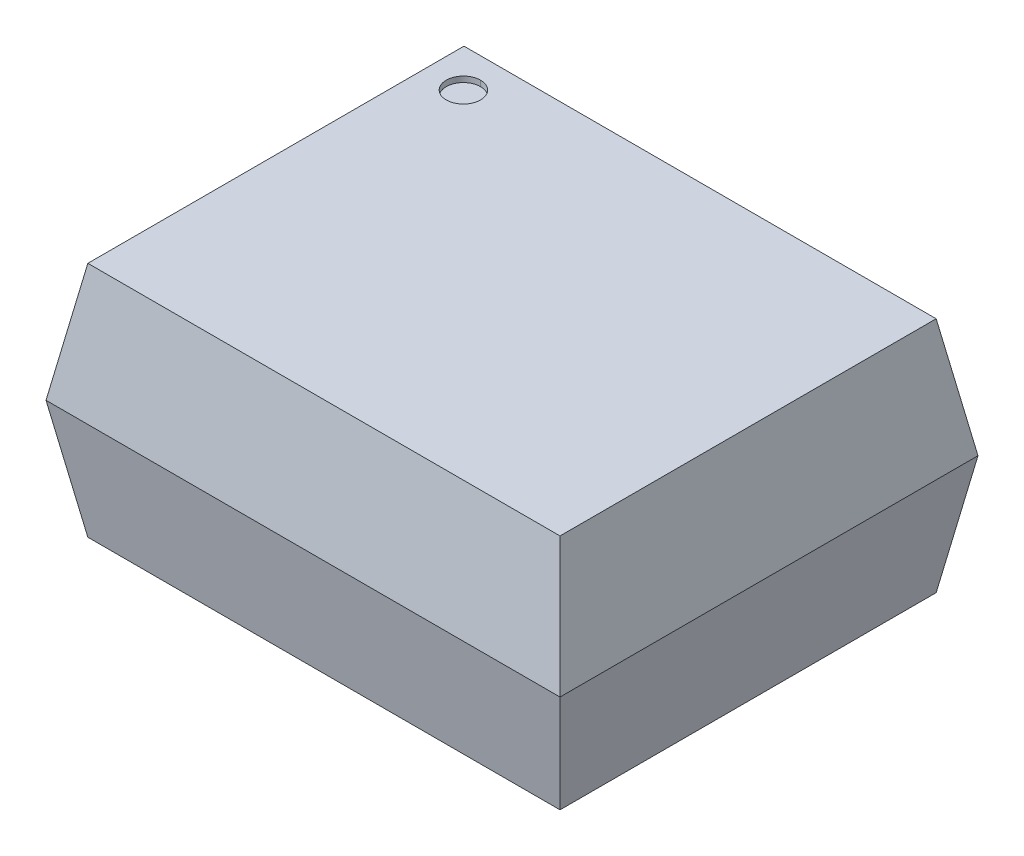
ISO-10303-21;
HEADER;
FILE_DESCRIPTION(('STEP AP214'),'2;1');
FILE_NAME('part.step','',(''),(''),'','','');
FILE_SCHEMA(('AUTOMOTIVE_DESIGN { 1 0 10303 214 1 1 1 1 }'));
ENDSEC;
DATA;
#1=APPLICATION_CONTEXT('core data for automotive mechanical design processes');
#2=APPLICATION_PROTOCOL_DEFINITION('international standard','automotive_design',2000,#1);
#3=PRODUCT_CONTEXT('',#1,'mechanical');
#4=PRODUCT('Part','Part','',(#3));
#5=PRODUCT_RELATED_PRODUCT_CATEGORY('part','',(#4));
#6=PRODUCT_DEFINITION_FORMATION('','',#4);
#7=PRODUCT_DEFINITION_CONTEXT('part definition',#1,'design');
#8=PRODUCT_DEFINITION('design','',#6,#7);
#9=PRODUCT_DEFINITION_SHAPE('','',#8);
#10=(LENGTH_UNIT() NAMED_UNIT(*) SI_UNIT(.MILLI.,.METRE.));
#11=(NAMED_UNIT(*) PLANE_ANGLE_UNIT() SI_UNIT($,.RADIAN.));
#12=(NAMED_UNIT(*) SI_UNIT($,.STERADIAN.) SOLID_ANGLE_UNIT());
#13=UNCERTAINTY_MEASURE_WITH_UNIT(LENGTH_MEASURE(1.E-05),#10,'distance_accuracy_value','');
#14=(GEOMETRIC_REPRESENTATION_CONTEXT(3) GLOBAL_UNCERTAINTY_ASSIGNED_CONTEXT((#13)) GLOBAL_UNIT_ASSIGNED_CONTEXT((#10,
#11,#12)) REPRESENTATION_CONTEXT('',''));
#15=CARTESIAN_POINT('',(0.,0.,0.));
#16=DIRECTION('',(0.,0.,1.));
#17=DIRECTION('',(1.,0.,0.));
#18=AXIS2_PLACEMENT_3D('',#15,#16,#17);
#19=CARTESIAN_POINT('',(-1.755794417706,1.,-1.325589809383));
#20=DIRECTION('',(0.,1.,0.));
#21=DIRECTION('',(1.,0.,0.));
#22=AXIS2_PLACEMENT_3D('',#19,#20,#21);
#23=PLANE('',#22);
#24=CARTESIAN_POINT('',(-1.755794417706,1.,-1.325589809383));
#25=DIRECTION('',(0.,1.,0.));
#26=DIRECTION('',(0.,0.,1.));
#27=AXIS2_PLACEMENT_3D('',#24,#25,#26);
#28=CIRCLE('',#27,0.151869257398);
#29=CARTESIAN_POINT('',(-1.755794417706,1.,-1.173720551985));
#30=VERTEX_POINT('',#29);
#31=CARTESIAN_POINT('',(-1.755794417706,1.,-1.477459066782));
#32=VERTEX_POINT('',#31);
#33=EDGE_CURVE('E11',#30,#32,#28,.T.);
#34=ORIENTED_EDGE('',*,*,#33,.T.);
#35=CARTESIAN_POINT('',(-1.755794417706,1.,-1.325589809383));
#36=DIRECTION('',(0.,1.,0.));
#37=DIRECTION('',(0.,0.,1.));
#38=AXIS2_PLACEMENT_3D('',#35,#36,#37);
#39=CIRCLE('',#38,0.151869257398);
#40=EDGE_CURVE('E131',#32,#30,#39,.T.);
#41=ORIENTED_EDGE('',*,*,#40,.T.);
#42=EDGE_LOOP('',(#34,#41));
#43=FACE_BOUND('',#42,.T.);
#44=ADVANCED_FACE('F16',(#43),#23,.T.);
#45=CARTESIAN_POINT('',(-1.755794417706,1.,-1.325589809383));
#46=DIRECTION('',(0.,1.,0.));
#47=DIRECTION('',(0.,0.,1.));
#48=AXIS2_PLACEMENT_3D('',#45,#46,#47);
#49=CYLINDRICAL_SURFACE('',#48,0.151869257398);
#50=DIRECTION('',(0.,1.,0.));
#51=VECTOR('',#50,1.);
#52=CARTESIAN_POINT('',(-1.755794417706,1.,-1.477459066782));
#53=LINE('',#52,#51);
#54=CARTESIAN_POINT('',(-1.755794417706,1.05,-1.477459066782));
#55=VERTEX_POINT('',#54);
#56=EDGE_CURVE('E127',#32,#55,#53,.T.);
#57=ORIENTED_EDGE('',*,*,#56,.F.);
#58=ORIENTED_EDGE('',*,*,#33,.F.);
#59=DIRECTION('',(0.,1.,0.));
#60=VECTOR('',#59,1.);
#61=CARTESIAN_POINT('',(-1.755794417706,1.,-1.173720551985));
#62=LINE('',#61,#60);
#63=CARTESIAN_POINT('',(-1.755794417706,1.05,-1.173720551985));
#64=VERTEX_POINT('',#63);
#65=EDGE_CURVE('E151',#30,#64,#62,.T.);
#66=ORIENTED_EDGE('',*,*,#65,.T.);
#67=CARTESIAN_POINT('',(-1.755794417706,1.05,-1.325589809383));
#68=DIRECTION('',(0.,1.,0.));
#69=DIRECTION('',(0.,0.,1.));
#70=AXIS2_PLACEMENT_3D('',#67,#68,#69);
#71=CIRCLE('',#70,0.151869257398);
#72=EDGE_CURVE('E121',#64,#55,#71,.T.);
#73=ORIENTED_EDGE('',*,*,#72,.T.);
#74=EDGE_LOOP('',(#57,#58,#66,#73));
#75=FACE_BOUND('',#74,.T.);
#76=ADVANCED_FACE('F217',(#75),#49,.F.);
#77=CARTESIAN_POINT('',(0.,-1.05,0.));
#78=DIRECTION('',(0.,-1.,0.));
#79=DIRECTION('',(0.,0.,-1.));
#80=AXIS2_PLACEMENT_3D('',#77,#78,#79);
#81=PLANE('',#80);
#82=DIRECTION('',(0.,0.,-1.));
#83=VECTOR('',#82,1.);
#84=CARTESIAN_POINT('',(-2.089856670256,-1.05,-1.85));
#85=LINE('',#84,#83);
#86=CARTESIAN_POINT('',(-2.089856670256,-1.05,1.664856670256));
#87=VERTEX_POINT('',#86);
#88=CARTESIAN_POINT('',(-2.089856670256,-1.05,-1.664856670256));
#89=VERTEX_POINT('',#88);
#90=EDGE_CURVE('E100',#87,#89,#85,.T.);
#91=ORIENTED_EDGE('',*,*,#90,.T.);
#92=DIRECTION('',(1.,0.,0.));
#93=VECTOR('',#92,1.);
#94=CARTESIAN_POINT('',(2.275,-1.05,-1.664856670256));
#95=LINE('',#94,#93);
#96=CARTESIAN_POINT('',(2.089856670256,-1.05,-1.664856670256));
#97=VERTEX_POINT('',#96);
#98=EDGE_CURVE('E20',#89,#97,#95,.T.);
#99=ORIENTED_EDGE('',*,*,#98,.T.);
#100=DIRECTION('',(0.,0.,1.));
#101=VECTOR('',#100,1.);
#102=CARTESIAN_POINT('',(2.089856670256,-1.05,-1.85));
#103=LINE('',#102,#101);
#104=CARTESIAN_POINT('',(2.089856670256,-1.05,1.664856670256));
#105=VERTEX_POINT('',#104);
#106=EDGE_CURVE('E101',#97,#105,#103,.T.);
#107=ORIENTED_EDGE('',*,*,#106,.T.);
#108=DIRECTION('',(-1.,0.,0.));
#109=VECTOR('',#108,1.);
#110=CARTESIAN_POINT('',(2.275,-1.05,1.664856670256));
#111=LINE('',#110,#109);
#112=EDGE_CURVE('E27',#105,#87,#111,.T.);
#113=ORIENTED_EDGE('',*,*,#112,.T.);
#114=EDGE_LOOP('',(#91,#99,#107,#113));
#115=FACE_BOUND('',#114,.T.);
#116=ADVANCED_FACE('F98',(#115),#81,.T.);
#117=CARTESIAN_POINT('',(2.275,0.,1.85));
#118=DIRECTION('',(0.,-0.173648177667033,0.98480775301219));
#119=DIRECTION('',(-1.,0.,0.));
#120=AXIS2_PLACEMENT_3D('',#117,#118,#119);
#121=PLANE('',#120);
#122=DIRECTION('',(1.,0.,0.));
#123=VECTOR('',#122,1.);
#124=CARTESIAN_POINT('',(-2.275,0.,1.85));
#125=LINE('',#124,#123);
#126=CARTESIAN_POINT('',(-2.275,0.,1.85));
#127=VERTEX_POINT('',#126);
#128=CARTESIAN_POINT('',(2.275,0.,1.85));
#129=VERTEX_POINT('',#128);
#130=EDGE_CURVE('E109',#127,#129,#125,.T.);
#131=ORIENTED_EDGE('',*,*,#130,.F.);
#132=DIRECTION('',(-0.171087869745971,0.970287525247837,0.171087869745971));
#133=VECTOR('',#132,1.);
#134=CARTESIAN_POINT('',(-2.166697081055,-0.614216375222,1.741697081055));
#135=LINE('',#134,#133);
#136=EDGE_CURVE('E106',#87,#127,#135,.T.);
#137=ORIENTED_EDGE('',*,*,#136,.F.);
#138=ORIENTED_EDGE('',*,*,#112,.F.);
#139=DIRECTION('',(0.171087869745971,0.970287525247837,0.171087869745971));
#140=VECTOR('',#139,1.);
#141=CARTESIAN_POINT('',(2.275,0.,1.85));
#142=LINE('',#141,#140);
#143=EDGE_CURVE('E189',#105,#129,#142,.T.);
#144=ORIENTED_EDGE('',*,*,#143,.T.);
#145=EDGE_LOOP('',(#131,#137,#138,#144));
#146=FACE_BOUND('',#145,.T.);
#147=ADVANCED_FACE('F107',(#146),#121,.T.);
#148=CARTESIAN_POINT('',(2.275,0.,-1.85));
#149=DIRECTION('',(0.98480775301219,-0.173648177667033,0.));
#150=DIRECTION('',(0.,0.,-1.));
#151=AXIS2_PLACEMENT_3D('',#148,#149,#150);
#152=PLANE('',#151);
#153=DIRECTION('',(0.,0.,-1.));
#154=VECTOR('',#153,1.);
#155=CARTESIAN_POINT('',(2.275,0.,-1.85));
#156=LINE('',#155,#154);
#157=CARTESIAN_POINT('',(2.275,0.,-1.85));
#158=VERTEX_POINT('',#157);
#159=EDGE_CURVE('E155',#129,#158,#156,.T.);
#160=ORIENTED_EDGE('',*,*,#159,.F.);
#161=ORIENTED_EDGE('',*,*,#143,.F.);
#162=ORIENTED_EDGE('',*,*,#106,.F.);
#163=DIRECTION('',(0.171087869745971,0.970287525247837,-0.171087869745971));
#164=VECTOR('',#163,1.);
#165=CARTESIAN_POINT('',(2.275,0.,-1.85));
#166=LINE('',#165,#164);
#167=EDGE_CURVE('E113',#97,#158,#166,.T.);
#168=ORIENTED_EDGE('',*,*,#167,.T.);
#169=EDGE_LOOP('',(#160,#161,#162,#168));
#170=FACE_BOUND('',#169,.T.);
#171=ADVANCED_FACE('F237',(#170),#152,.T.);
#172=CARTESIAN_POINT('',(2.275,0.,-1.85));
#173=DIRECTION('',(0.,-0.173648177667033,-0.98480775301219));
#174=DIRECTION('',(0.,-0.98480775301219,0.173648177667033));
#175=AXIS2_PLACEMENT_3D('',#172,#173,#174);
#176=PLANE('',#175);
#177=DIRECTION('',(-1.,0.,0.));
#178=VECTOR('',#177,1.);
#179=CARTESIAN_POINT('',(-2.275,0.,-1.85));
#180=LINE('',#179,#178);
#181=CARTESIAN_POINT('',(-2.275,0.,-1.85));
#182=VERTEX_POINT('',#181);
#183=EDGE_CURVE('E146',#158,#182,#180,.T.);
#184=ORIENTED_EDGE('',*,*,#183,.F.);
#185=ORIENTED_EDGE('',*,*,#167,.F.);
#186=ORIENTED_EDGE('',*,*,#98,.F.);
#187=DIRECTION('',(-0.171087869745971,0.970287525247837,-0.171087869745971));
#188=VECTOR('',#187,1.);
#189=CARTESIAN_POINT('',(-2.141816680757,-0.755320137098,-1.716816680757));
#190=LINE('',#189,#188);
#191=EDGE_CURVE('E58',#89,#182,#190,.T.);
#192=ORIENTED_EDGE('',*,*,#191,.T.);
#193=EDGE_LOOP('',(#184,#185,#186,#192));
#194=FACE_BOUND('',#193,.T.);
#195=ADVANCED_FACE('F245',(#194),#176,.T.);
#196=CARTESIAN_POINT('',(-2.275,0.,-1.85));
#197=DIRECTION('',(-0.98480775301219,-0.173648177667033,0.));
#198=DIRECTION('',(-0.173648177667033,0.98480775301219,0.));
#199=AXIS2_PLACEMENT_3D('',#196,#197,#198);
#200=PLANE('',#199);
#201=DIRECTION('',(0.,0.,1.));
#202=VECTOR('',#201,1.);
#203=CARTESIAN_POINT('',(-2.275,0.,-1.85));
#204=LINE('',#203,#202);
#205=EDGE_CURVE('E132',#182,#127,#204,.T.);
#206=ORIENTED_EDGE('',*,*,#205,.F.);
#207=ORIENTED_EDGE('',*,*,#191,.F.);
#208=ORIENTED_EDGE('',*,*,#90,.F.);
#209=ORIENTED_EDGE('',*,*,#136,.T.);
#210=EDGE_LOOP('',(#206,#207,#208,#209));
#211=FACE_BOUND('',#210,.T.);
#212=ADVANCED_FACE('F115',(#211),#200,.T.);
#213=CARTESIAN_POINT('',(0.,1.05,0.));
#214=DIRECTION('',(0.,1.,0.));
#215=DIRECTION('',(1.,0.,0.));
#216=AXIS2_PLACEMENT_3D('',#213,#214,#215);
#217=PLANE('',#216);
#218=DIRECTION('',(0.,0.,-1.));
#219=VECTOR('',#218,1.);
#220=CARTESIAN_POINT('',(2.089856670256,1.05,-1.85));
#221=LINE('',#220,#219);
#222=CARTESIAN_POINT('',(2.089856670256,1.05,1.664856670256));
#223=VERTEX_POINT('',#222);
#224=CARTESIAN_POINT('',(2.089856670256,1.05,-1.664856670256));
#225=VERTEX_POINT('',#224);
#226=EDGE_CURVE('E147',#223,#225,#221,.T.);
#227=ORIENTED_EDGE('',*,*,#226,.T.);
#228=DIRECTION('',(-1.,0.,0.));
#229=VECTOR('',#228,1.);
#230=CARTESIAN_POINT('',(-2.275,1.05,-1.664856670256));
#231=LINE('',#230,#229);
#232=CARTESIAN_POINT('',(-2.089856670256,1.05,-1.664856670256));
#233=VERTEX_POINT('',#232);
#234=EDGE_CURVE('E137',#225,#233,#231,.T.);
#235=ORIENTED_EDGE('',*,*,#234,.T.);
#236=DIRECTION('',(0.,0.,1.));
#237=VECTOR('',#236,1.);
#238=CARTESIAN_POINT('',(-2.089856670256,1.05,-1.85));
#239=LINE('',#238,#237);
#240=CARTESIAN_POINT('',(-2.089856670256,1.05,1.664856670256));
#241=VERTEX_POINT('',#240);
#242=EDGE_CURVE('E158',#233,#241,#239,.T.);
#243=ORIENTED_EDGE('',*,*,#242,.T.);
#244=DIRECTION('',(1.,0.,0.));
#245=VECTOR('',#244,1.);
#246=CARTESIAN_POINT('',(-2.275,1.05,1.664856670256));
#247=LINE('',#246,#245);
#248=EDGE_CURVE('E74',#241,#223,#247,.T.);
#249=ORIENTED_EDGE('',*,*,#248,.T.);
#250=EDGE_LOOP('',(#227,#235,#243,#249));
#251=FACE_BOUND('',#250,.T.);
#252=ORIENTED_EDGE('',*,*,#72,.F.);
#253=CARTESIAN_POINT('',(-1.755794417706,1.05,-1.325589809383));
#254=DIRECTION('',(0.,1.,0.));
#255=DIRECTION('',(0.,0.,1.));
#256=AXIS2_PLACEMENT_3D('',#253,#254,#255);
#257=CIRCLE('',#256,0.151869257398);
#258=EDGE_CURVE('E124',#55,#64,#257,.T.);
#259=ORIENTED_EDGE('',*,*,#258,.F.);
#260=EDGE_LOOP('',(#252,#259));
#261=FACE_BOUND('',#260,.T.);
#262=ADVANCED_FACE('F216',(#251,#261),#217,.T.);
#263=CARTESIAN_POINT('',(-2.275,0.,1.85));
#264=DIRECTION('',(0.,0.173648177667033,0.98480775301219));
#265=DIRECTION('',(1.,0.,0.));
#266=AXIS2_PLACEMENT_3D('',#263,#264,#265);
#267=PLANE('',#266);
#268=ORIENTED_EDGE('',*,*,#130,.T.);
#269=DIRECTION('',(0.171087869745971,-0.970287525247837,0.171087869745971));
#270=VECTOR('',#269,1.);
#271=CARTESIAN_POINT('',(2.166697081055,0.614216375222,1.741697081055));
#272=LINE('',#271,#270);
#273=EDGE_CURVE('E142',#223,#129,#272,.T.);
#274=ORIENTED_EDGE('',*,*,#273,.F.);
#275=ORIENTED_EDGE('',*,*,#248,.F.);
#276=DIRECTION('',(-0.171087869745971,-0.970287525247837,0.171087869745971));
#277=VECTOR('',#276,1.);
#278=CARTESIAN_POINT('',(-2.275,0.,1.85));
#279=LINE('',#278,#277);
#280=EDGE_CURVE('E136',#241,#127,#279,.T.);
#281=ORIENTED_EDGE('',*,*,#280,.T.);
#282=EDGE_LOOP('',(#268,#274,#275,#281));
#283=FACE_BOUND('',#282,.T.);
#284=ADVANCED_FACE('F231',(#283),#267,.T.);
#285=CARTESIAN_POINT('',(-2.275,0.,-1.85));
#286=DIRECTION('',(-0.98480775301219,0.173648177667033,0.));
#287=DIRECTION('',(0.,0.,1.));
#288=AXIS2_PLACEMENT_3D('',#285,#286,#287);
#289=PLANE('',#288);
#290=ORIENTED_EDGE('',*,*,#205,.T.);
#291=ORIENTED_EDGE('',*,*,#280,.F.);
#292=ORIENTED_EDGE('',*,*,#242,.F.);
#293=DIRECTION('',(-0.171087869745971,-0.970287525247837,-0.171087869745971));
#294=VECTOR('',#293,1.);
#295=CARTESIAN_POINT('',(-2.275,0.,-1.85));
#296=LINE('',#295,#294);
#297=EDGE_CURVE('E141',#233,#182,#296,.T.);
#298=ORIENTED_EDGE('',*,*,#297,.T.);
#299=EDGE_LOOP('',(#290,#291,#292,#298));
#300=FACE_BOUND('',#299,.T.);
#301=ADVANCED_FACE('F18',(#300),#289,.T.);
#302=CARTESIAN_POINT('',(-2.275,0.,-1.85));
#303=DIRECTION('',(0.,0.173648177667033,-0.98480775301219));
#304=DIRECTION('',(-1.,0.,0.));
#305=AXIS2_PLACEMENT_3D('',#302,#303,#304);
#306=PLANE('',#305);
#307=ORIENTED_EDGE('',*,*,#183,.T.);
#308=ORIENTED_EDGE('',*,*,#297,.F.);
#309=ORIENTED_EDGE('',*,*,#234,.F.);
#310=DIRECTION('',(0.171087869745971,-0.970287525247837,-0.171087869745971));
#311=VECTOR('',#310,1.);
#312=CARTESIAN_POINT('',(2.141816680757,0.755320137098,-1.716816680757));
#313=LINE('',#312,#311);
#314=EDGE_CURVE('E165',#225,#158,#313,.T.);
#315=ORIENTED_EDGE('',*,*,#314,.T.);
#316=EDGE_LOOP('',(#307,#308,#309,#315));
#317=FACE_BOUND('',#316,.T.);
#318=ADVANCED_FACE('F241',(#317),#306,.T.);
#319=CARTESIAN_POINT('',(2.275,0.,-1.85));
#320=DIRECTION('',(0.98480775301219,0.173648177667033,0.));
#321=DIRECTION('',(0.,0.,-1.));
#322=AXIS2_PLACEMENT_3D('',#319,#320,#321);
#323=PLANE('',#322);
#324=ORIENTED_EDGE('',*,*,#159,.T.);
#325=ORIENTED_EDGE('',*,*,#314,.F.);
#326=ORIENTED_EDGE('',*,*,#226,.F.);
#327=ORIENTED_EDGE('',*,*,#273,.T.);
#328=EDGE_LOOP('',(#324,#325,#326,#327));
#329=FACE_BOUND('',#328,.T.);
#330=ADVANCED_FACE('F238',(#329),#323,.T.);
#331=CARTESIAN_POINT('',(-1.755794417706,1.,-1.325589809383));
#332=DIRECTION('',(0.,1.,0.));
#333=DIRECTION('',(0.,0.,1.));
#334=AXIS2_PLACEMENT_3D('',#331,#332,#333);
#335=CYLINDRICAL_SURFACE('',#334,0.151869257398);
#336=ORIENTED_EDGE('',*,*,#40,.F.);
#337=ORIENTED_EDGE('',*,*,#56,.T.);
#338=ORIENTED_EDGE('',*,*,#258,.T.);
#339=ORIENTED_EDGE('',*,*,#65,.F.);
#340=EDGE_LOOP('',(#336,#337,#338,#339));
#341=FACE_BOUND('',#340,.T.);
#342=ADVANCED_FACE('F205',(#341),#335,.F.);
#343=CLOSED_SHELL('',(#44,#76,#116,#147,#171,#195,#212,#262,#284,#301,#318,#330,#342));
#344=MANIFOLD_SOLID_BREP('B1',#343);
#345=ADVANCED_BREP_SHAPE_REPRESENTATION('',(#18,#344),#14);
#346=SHAPE_DEFINITION_REPRESENTATION(#9,#345);
ENDSEC;
END-ISO-10303-21;
